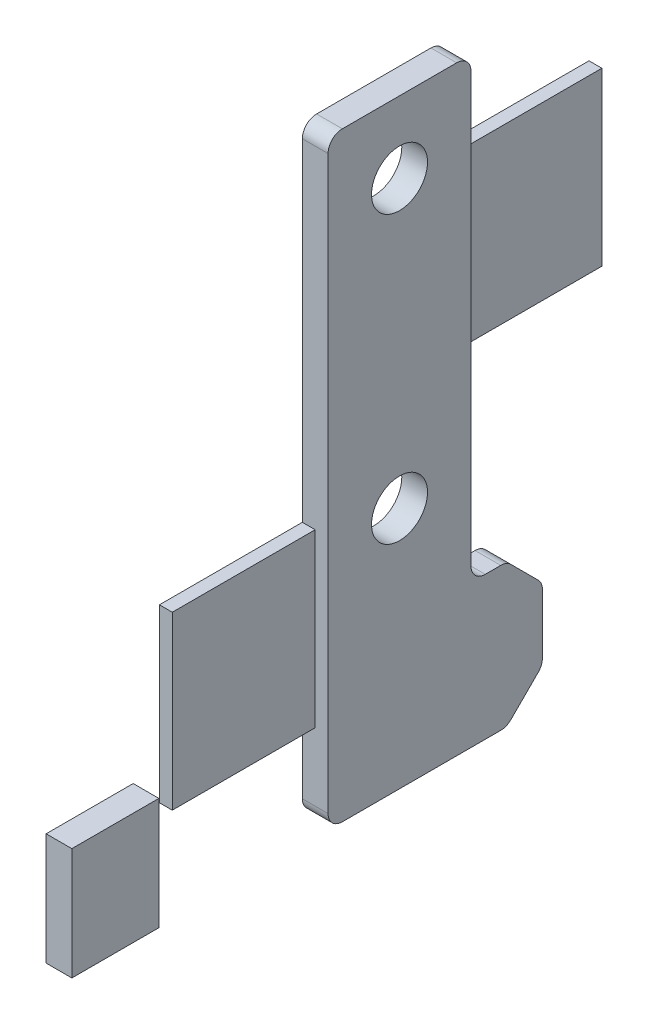
ISO-10303-21;
HEADER;
FILE_DESCRIPTION(('STEP AP214'),'2;1');
FILE_NAME('part.step','',(''),(''),'','','');
FILE_SCHEMA(('AUTOMOTIVE_DESIGN { 1 0 10303 214 1 1 1 1 }'));
ENDSEC;
DATA;
#1=APPLICATION_CONTEXT('core data for automotive mechanical design processes');
#2=APPLICATION_PROTOCOL_DEFINITION('international standard','automotive_design',2000,#1);
#3=PRODUCT_CONTEXT('',#1,'mechanical');
#4=PRODUCT('Part','Part','',(#3));
#5=PRODUCT_RELATED_PRODUCT_CATEGORY('part','',(#4));
#6=PRODUCT_DEFINITION_FORMATION('','',#4);
#7=PRODUCT_DEFINITION_CONTEXT('part definition',#1,'design');
#8=PRODUCT_DEFINITION('design','',#6,#7);
#9=PRODUCT_DEFINITION_SHAPE('','',#8);
#10=(LENGTH_UNIT() NAMED_UNIT(*) SI_UNIT(.MILLI.,.METRE.));
#11=(NAMED_UNIT(*) PLANE_ANGLE_UNIT() SI_UNIT($,.RADIAN.));
#12=(NAMED_UNIT(*) SI_UNIT($,.STERADIAN.) SOLID_ANGLE_UNIT());
#13=UNCERTAINTY_MEASURE_WITH_UNIT(LENGTH_MEASURE(1.E-05),#10,'distance_accuracy_value','');
#14=(GEOMETRIC_REPRESENTATION_CONTEXT(3) GLOBAL_UNCERTAINTY_ASSIGNED_CONTEXT((#13)) GLOBAL_UNIT_ASSIGNED_CONTEXT((#10,
#11,#12)) REPRESENTATION_CONTEXT('',''));
#15=CARTESIAN_POINT('',(0.,0.,0.));
#16=DIRECTION('',(0.,0.,1.));
#17=DIRECTION('',(1.,0.,0.));
#18=AXIS2_PLACEMENT_3D('',#15,#16,#17);
#19=CARTESIAN_POINT('',(14.8946076048408,0.,14.0803932968794));
#20=DIRECTION('',(0.,0.,1.));
#21=DIRECTION('',(1.,0.,0.));
#22=AXIS2_PLACEMENT_3D('',#19,#20,#21);
#23=PLANE('',#22);
#24=DIRECTION('',(0.,-1.,0.));
#25=VECTOR('',#24,1.);
#26=CARTESIAN_POINT('',(2.286,0.,14.0803932968794));
#27=LINE('',#26,#25);
#28=CARTESIAN_POINT('',(2.286,9.95723934664028,14.0803932968794));
#29=VERTEX_POINT('',#28);
#30=CARTESIAN_POINT('',(2.286,0.,14.0803932968794));
#31=VERTEX_POINT('',#30);
#32=EDGE_CURVE('E78',#29,#31,#27,.T.);
#33=ORIENTED_EDGE('',*,*,#32,.F.);
#34=DIRECTION('',(-1.,0.,0.));
#35=VECTOR('',#34,1.);
#36=CARTESIAN_POINT('',(14.8946076048408,9.95723934664028,14.0803932968794));
#37=LINE('',#36,#35);
#38=CARTESIAN_POINT('',(0.,9.95723934664028,14.0803932968794));
#39=VERTEX_POINT('',#38);
#40=EDGE_CURVE('E106',#29,#39,#37,.T.);
#41=ORIENTED_EDGE('',*,*,#40,.T.);
#42=DIRECTION('',(0.,1.,0.));
#43=VECTOR('',#42,1.);
#44=CARTESIAN_POINT('',(0.,0.,14.0803932968794));
#45=LINE('',#44,#43);
#46=CARTESIAN_POINT('',(0.,0.,14.0803932968794));
#47=VERTEX_POINT('',#46);
#48=EDGE_CURVE('E110',#47,#39,#45,.T.);
#49=ORIENTED_EDGE('',*,*,#48,.F.);
#50=DIRECTION('',(-1.,0.,0.));
#51=VECTOR('',#50,1.);
#52=CARTESIAN_POINT('',(14.8946076048408,0.,14.0803932968794));
#53=LINE('',#52,#51);
#54=EDGE_CURVE('E133',#31,#47,#53,.T.);
#55=ORIENTED_EDGE('',*,*,#54,.F.);
#56=EDGE_LOOP('',(#33,#41,#49,#55));
#57=FACE_BOUND('',#56,.T.);
#58=ADVANCED_FACE('F70',(#57),#23,.T.);
#59=CARTESIAN_POINT('',(14.8946076048408,0.,14.0803932968794));
#60=DIRECTION('',(0.,-1.,0.));
#61=DIRECTION('',(0.,0.,-1.));
#62=AXIS2_PLACEMENT_3D('',#59,#60,#61);
#63=PLANE('',#62);
#64=DIRECTION('',(0.,0.,-1.));
#65=VECTOR('',#64,1.);
#66=CARTESIAN_POINT('',(2.286,0.,14.0803932968794));
#67=LINE('',#66,#65);
#68=CARTESIAN_POINT('',(2.286,0.,6.34538390279538));
#69=VERTEX_POINT('',#68);
#70=EDGE_CURVE('E84',#31,#69,#67,.T.);
#71=ORIENTED_EDGE('',*,*,#70,.F.);
#72=ORIENTED_EDGE('',*,*,#54,.T.);
#73=DIRECTION('',(0.,0.,1.));
#74=VECTOR('',#73,1.);
#75=CARTESIAN_POINT('',(0.,0.,14.0803932968794));
#76=LINE('',#75,#74);
#77=CARTESIAN_POINT('',(0.,0.,6.34538390279538));
#78=VERTEX_POINT('',#77);
#79=EDGE_CURVE('E115',#78,#47,#76,.T.);
#80=ORIENTED_EDGE('',*,*,#79,.F.);
#81=DIRECTION('',(-1.,0.,0.));
#82=VECTOR('',#81,1.);
#83=CARTESIAN_POINT('',(14.8946076048408,0.,6.34538390279538));
#84=LINE('',#83,#82);
#85=EDGE_CURVE('E136',#69,#78,#84,.T.);
#86=ORIENTED_EDGE('',*,*,#85,.F.);
#87=EDGE_LOOP('',(#71,#72,#80,#86));
#88=FACE_BOUND('',#87,.T.);
#89=ADVANCED_FACE('F142',(#88),#63,.T.);
#90=CARTESIAN_POINT('',(14.8946076048408,0.,6.34538390279538));
#91=DIRECTION('',(0.,0.,-1.));
#92=DIRECTION('',(-1.,0.,0.));
#93=AXIS2_PLACEMENT_3D('',#90,#91,#92);
#94=PLANE('',#93);
#95=DIRECTION('',(0.,1.,0.));
#96=VECTOR('',#95,1.);
#97=CARTESIAN_POINT('',(2.286,0.,6.34538390279538));
#98=LINE('',#97,#96);
#99=CARTESIAN_POINT('',(2.286,9.95723934664028,6.34538390279538));
#100=VERTEX_POINT('',#99);
#101=EDGE_CURVE('E135',#69,#100,#98,.T.);
#102=ORIENTED_EDGE('',*,*,#101,.F.);
#103=ORIENTED_EDGE('',*,*,#85,.T.);
#104=DIRECTION('',(0.,-1.,0.));
#105=VECTOR('',#104,1.);
#106=CARTESIAN_POINT('',(0.,0.,6.34538390279538));
#107=LINE('',#106,#105);
#108=CARTESIAN_POINT('',(0.,9.95723934664028,6.34538390279538));
#109=VERTEX_POINT('',#108);
#110=EDGE_CURVE('E123',#109,#78,#107,.T.);
#111=ORIENTED_EDGE('',*,*,#110,.F.);
#112=DIRECTION('',(-1.,0.,0.));
#113=VECTOR('',#112,1.);
#114=CARTESIAN_POINT('',(14.8946076048408,9.95723934664028,6.34538390279538));
#115=LINE('',#114,#113);
#116=EDGE_CURVE('E114',#100,#109,#115,.T.);
#117=ORIENTED_EDGE('',*,*,#116,.F.);
#118=EDGE_LOOP('',(#102,#103,#111,#117));
#119=FACE_BOUND('',#118,.T.);
#120=ADVANCED_FACE('F140',(#119),#94,.T.);
#121=CARTESIAN_POINT('',(14.8946076048408,9.95723934664028,14.0803932968794));
#122=DIRECTION('',(0.,1.,0.));
#123=DIRECTION('',(0.,0.,1.));
#124=AXIS2_PLACEMENT_3D('',#121,#122,#123);
#125=PLANE('',#124);
#126=DIRECTION('',(0.,0.,1.));
#127=VECTOR('',#126,1.);
#128=CARTESIAN_POINT('',(2.286,9.95723934664028,14.0803932968794));
#129=LINE('',#128,#127);
#130=EDGE_CURVE('E13',#100,#29,#129,.T.);
#131=ORIENTED_EDGE('',*,*,#130,.F.);
#132=ORIENTED_EDGE('',*,*,#116,.T.);
#133=DIRECTION('',(0.,0.,-1.));
#134=VECTOR('',#133,1.);
#135=CARTESIAN_POINT('',(0.,9.95723934664028,14.0803932968794));
#136=LINE('',#135,#134);
#137=EDGE_CURVE('E117',#39,#109,#136,.T.);
#138=ORIENTED_EDGE('',*,*,#137,.F.);
#139=ORIENTED_EDGE('',*,*,#40,.F.);
#140=EDGE_LOOP('',(#131,#132,#138,#139));
#141=FACE_BOUND('',#140,.T.);
#142=ADVANCED_FACE('F118',(#141),#125,.T.);
#143=CARTESIAN_POINT('',(0.,0.,0.));
#144=DIRECTION('',(-1.,0.,0.));
#145=DIRECTION('',(0.,0.,1.));
#146=AXIS2_PLACEMENT_3D('',#143,#144,#145);
#147=PLANE('',#146);
#148=ORIENTED_EDGE('',*,*,#48,.T.);
#149=ORIENTED_EDGE('',*,*,#137,.T.);
#150=ORIENTED_EDGE('',*,*,#110,.T.);
#151=ORIENTED_EDGE('',*,*,#79,.T.);
#152=EDGE_LOOP('',(#148,#149,#150,#151));
#153=FACE_BOUND('',#152,.T.);
#154=ADVANCED_FACE('F125',(#153),#147,.T.);
#155=CARTESIAN_POINT('',(2.286,0.,0.));
#156=DIRECTION('',(-1.,0.,0.));
#157=DIRECTION('',(0.,0.,1.));
#158=AXIS2_PLACEMENT_3D('',#155,#156,#157);
#159=PLANE('',#158);
#160=ORIENTED_EDGE('',*,*,#32,.T.);
#161=ORIENTED_EDGE('',*,*,#70,.T.);
#162=ORIENTED_EDGE('',*,*,#101,.T.);
#163=ORIENTED_EDGE('',*,*,#130,.T.);
#164=EDGE_LOOP('',(#160,#161,#162,#163));
#165=FACE_BOUND('',#164,.T.);
#166=ADVANCED_FACE('F144',(#165),#159,.F.);
#167=CLOSED_SHELL('',(#58,#89,#120,#142,#154,#166));
#168=MANIFOLD_SOLID_BREP('B2',#167);
#169=CARTESIAN_POINT('',(2.286,0.,0.));
#170=DIRECTION('',(-1.,0.,0.));
#171=DIRECTION('',(0.,0.,1.));
#172=AXIS2_PLACEMENT_3D('',#169,#170,#171);
#173=PLANE('',#172);
#174=DIRECTION('',(0.,-0.707106781186546,0.707106781186549));
#175=VECTOR('',#174,1.);
#176=CARTESIAN_POINT('',(2.286,3.17499999999999,-27.7380499050858));
#177=LINE('',#176,#175);
#178=CARTESIAN_POINT('',(2.286,0.37197438789308,-24.9350242929789));
#179=VERTEX_POINT('',#178);
#180=CARTESIAN_POINT('',(2.286,2.8030256121069,-27.3660755171927));
#181=VERTEX_POINT('',#180);
#182=EDGE_CURVE('E585',#179,#181,#177,.F.);
#183=ORIENTED_EDGE('',*,*,#182,.T.);
#184=CARTESIAN_POINT('',(2.286,3.70105122421382,-26.4680499050858));
#185=DIRECTION('',(-1.,0.,0.));
#186=DIRECTION('',(0.,0.,1.));
#187=AXIS2_PLACEMENT_3D('',#184,#185,#186);
#188=CIRCLE('',#187,1.27);
#189=CARTESIAN_POINT('',(2.286,3.70105122421382,-27.7380499050858));
#190=VERTEX_POINT('',#189);
#191=EDGE_CURVE('E504',#181,#190,#188,.F.);
#192=ORIENTED_EDGE('',*,*,#191,.T.);
#193=DIRECTION('',(0.,1.,0.));
#194=VECTOR('',#193,1.);
#195=CARTESIAN_POINT('',(2.286,12.7,-27.7380499050858));
#196=LINE('',#195,#194);
#197=CARTESIAN_POINT('',(2.286,8.99894877578617,-27.7380499050858));
#198=VERTEX_POINT('',#197);
#199=EDGE_CURVE('E454',#190,#198,#196,.T.);
#200=ORIENTED_EDGE('',*,*,#199,.T.);
#201=CARTESIAN_POINT('',(2.286,8.99894877578617,-26.4680499050858));
#202=DIRECTION('',(-1.,0.,0.));
#203=DIRECTION('',(0.,0.,1.));
#204=AXIS2_PLACEMENT_3D('',#201,#202,#203);
#205=CIRCLE('',#204,1.27);
#206=CARTESIAN_POINT('',(2.286,9.89697438789308,-27.3660755171927));
#207=VERTEX_POINT('',#206);
#208=EDGE_CURVE('E495',#198,#207,#205,.F.);
#209=ORIENTED_EDGE('',*,*,#208,.T.);
#210=DIRECTION('',(0.,-0.707106781186549,-0.707106781186546));
#211=VECTOR('',#210,1.);
#212=CARTESIAN_POINT('',(2.286,12.7,-24.5630499050858));
#213=LINE('',#212,#211);
#214=CARTESIAN_POINT('',(2.286,12.3280256121069,-24.9350242929789));
#215=VERTEX_POINT('',#214);
#216=EDGE_CURVE('E582',#207,#215,#213,.F.);
#217=ORIENTED_EDGE('',*,*,#216,.T.);
#218=CARTESIAN_POINT('',(2.286,11.43,-24.036998680872));
#219=DIRECTION('',(-1.,0.,0.));
#220=DIRECTION('',(0.,0.,1.));
#221=AXIS2_PLACEMENT_3D('',#218,#219,#220);
#222=CIRCLE('',#221,1.27);
#223=CARTESIAN_POINT('',(2.286,12.7,-24.036998680872));
#224=VERTEX_POINT('',#223);
#225=EDGE_CURVE('E493',#215,#224,#222,.F.);
#226=ORIENTED_EDGE('',*,*,#225,.T.);
#227=DIRECTION('',(0.,0.,1.));
#228=VECTOR('',#227,1.);
#229=CARTESIAN_POINT('',(2.286,12.7,-21.3880499050858));
#230=LINE('',#229,#228);
#231=CARTESIAN_POINT('',(2.286,12.7,-22.6580499050858));
#232=VERTEX_POINT('',#231);
#233=EDGE_CURVE('E458',#224,#232,#230,.T.);
#234=ORIENTED_EDGE('',*,*,#233,.T.);
#235=CARTESIAN_POINT('',(2.286,13.97,-22.6580499050858));
#236=DIRECTION('',(-1.,0.,0.));
#237=DIRECTION('',(0.,0.,1.));
#238=AXIS2_PLACEMENT_3D('',#235,#236,#237);
#239=CIRCLE('',#238,1.27);
#240=CARTESIAN_POINT('',(2.286,13.97,-21.3880499050858));
#241=VERTEX_POINT('',#240);
#242=EDGE_CURVE('E68',#232,#241,#239,.T.);
#243=ORIENTED_EDGE('',*,*,#242,.T.);
#244=DIRECTION('',(0.,1.,0.));
#245=VECTOR('',#244,1.);
#246=CARTESIAN_POINT('',(2.286,53.34,-21.3880499050858));
#247=LINE('',#246,#245);
#248=CARTESIAN_POINT('',(2.286,52.07,-21.3880499050858));
#249=VERTEX_POINT('',#248);
#250=EDGE_CURVE('E464',#241,#249,#247,.T.);
#251=ORIENTED_EDGE('',*,*,#250,.T.);
#252=CARTESIAN_POINT('',(2.286,52.07,-20.1180499050858));
#253=DIRECTION('',(-1.,0.,0.));
#254=DIRECTION('',(0.,0.,1.));
#255=AXIS2_PLACEMENT_3D('',#252,#253,#254);
#256=CIRCLE('',#255,1.27);
#257=CARTESIAN_POINT('',(2.286,53.34,-20.1180499050858));
#258=VERTEX_POINT('',#257);
#259=EDGE_CURVE('E482',#249,#258,#256,.F.);
#260=ORIENTED_EDGE('',*,*,#259,.T.);
#261=DIRECTION('',(0.,0.,1.));
#262=VECTOR('',#261,1.);
#263=CARTESIAN_POINT('',(2.286,53.34,-8.68804990508582));
#264=LINE('',#263,#262);
#265=CARTESIAN_POINT('',(2.286,53.34,-9.95804990508582));
#266=VERTEX_POINT('',#265);
#267=EDGE_CURVE('E442',#258,#266,#264,.T.);
#268=ORIENTED_EDGE('',*,*,#267,.T.);
#269=CARTESIAN_POINT('',(2.286,52.07,-9.95804990508582));
#270=DIRECTION('',(-1.,0.,0.));
#271=DIRECTION('',(0.,0.,1.));
#272=AXIS2_PLACEMENT_3D('',#269,#270,#271);
#273=CIRCLE('',#272,1.27);
#274=CARTESIAN_POINT('',(2.286,52.07,-8.68804990508582));
#275=VERTEX_POINT('',#274);
#276=EDGE_CURVE('E480',#266,#275,#273,.F.);
#277=ORIENTED_EDGE('',*,*,#276,.T.);
#278=DIRECTION('',(0.,-1.,0.));
#279=VECTOR('',#278,1.);
#280=CARTESIAN_POINT('',(2.286,0.,-8.68804990508582));
#281=LINE('',#280,#279);
#282=CARTESIAN_POINT('',(2.286,1.27,-8.68804990508582));
#283=VERTEX_POINT('',#282);
#284=EDGE_CURVE('E435',#275,#283,#281,.T.);
#285=ORIENTED_EDGE('',*,*,#284,.T.);
#286=CARTESIAN_POINT('',(2.286,1.27,-9.95804990508582));
#287=DIRECTION('',(-1.,0.,0.));
#288=DIRECTION('',(0.,0.,1.));
#289=AXIS2_PLACEMENT_3D('',#286,#287,#288);
#290=CIRCLE('',#289,1.27);
#291=CARTESIAN_POINT('',(2.286,0.,-9.95804990508582));
#292=VERTEX_POINT('',#291);
#293=EDGE_CURVE('E497',#283,#292,#290,.F.);
#294=ORIENTED_EDGE('',*,*,#293,.T.);
#295=DIRECTION('',(0.,0.,-1.));
#296=VECTOR('',#295,1.);
#297=CARTESIAN_POINT('',(2.286,0.,-27.7380499050858));
#298=LINE('',#297,#296);
#299=CARTESIAN_POINT('',(2.286,0.,-24.036998680872));
#300=VERTEX_POINT('',#299);
#301=EDGE_CURVE('E459',#292,#300,#298,.T.);
#302=ORIENTED_EDGE('',*,*,#301,.T.);
#303=CARTESIAN_POINT('',(2.286,1.27,-24.036998680872));
#304=DIRECTION('',(-1.,0.,0.));
#305=DIRECTION('',(0.,0.,1.));
#306=AXIS2_PLACEMENT_3D('',#303,#304,#305);
#307=CIRCLE('',#306,1.27);
#308=EDGE_CURVE('E502',#300,#179,#307,.F.);
#309=ORIENTED_EDGE('',*,*,#308,.T.);
#310=EDGE_LOOP('',(#183,#192,#200,#209,#217,#226,#234,#243,#251,#260,#268,#277,#285,#294,#302,#309));
#311=FACE_BOUND('',#310,.T.);
#312=CARTESIAN_POINT('',(2.286,46.99,-15.0380499050858));
#313=DIRECTION('',(1.,0.,0.));
#314=DIRECTION('',(0.,0.,-1.));
#315=AXIS2_PLACEMENT_3D('',#312,#313,#314);
#316=CIRCLE('',#315,2.4892);
#317=CARTESIAN_POINT('',(2.286,46.99,-17.5272499050858));
#318=VERTEX_POINT('',#317);
#319=EDGE_CURVE('E623',#318,#318,#316,.T.);
#320=ORIENTED_EDGE('',*,*,#319,.F.);
#321=EDGE_LOOP('',(#320));
#322=FACE_BOUND('',#321,.T.);
#323=CARTESIAN_POINT('',(2.286,21.59,-15.0380499050858));
#324=DIRECTION('',(1.,0.,0.));
#325=DIRECTION('',(0.,0.,-1.));
#326=AXIS2_PLACEMENT_3D('',#323,#324,#325);
#327=CIRCLE('',#326,2.4892);
#328=CARTESIAN_POINT('',(2.286,21.59,-17.5272499050858));
#329=VERTEX_POINT('',#328);
#330=EDGE_CURVE('E421',#329,#329,#327,.T.);
#331=ORIENTED_EDGE('',*,*,#330,.F.);
#332=EDGE_LOOP('',(#331));
#333=FACE_BOUND('',#332,.T.);
#334=ADVANCED_FACE('F195',(#311,#322,#333),#173,.F.);
#335=CARTESIAN_POINT('',(0.,0.,0.));
#336=DIRECTION('',(-1.,0.,0.));
#337=DIRECTION('',(0.,0.,1.));
#338=AXIS2_PLACEMENT_3D('',#335,#336,#337);
#339=PLANE('',#338);
#340=CARTESIAN_POINT('',(0.,46.99,-15.0380499050858));
#341=DIRECTION('',(1.,0.,0.));
#342=DIRECTION('',(0.,0.,-1.));
#343=AXIS2_PLACEMENT_3D('',#340,#341,#342);
#344=CIRCLE('',#343,2.4892);
#345=CARTESIAN_POINT('',(0.,46.99,-17.5272499050858));
#346=VERTEX_POINT('',#345);
#347=EDGE_CURVE('E425',#346,#346,#344,.T.);
#348=ORIENTED_EDGE('',*,*,#347,.T.);
#349=EDGE_LOOP('',(#348));
#350=FACE_BOUND('',#349,.T.);
#351=DIRECTION('',(0.,1.,0.));
#352=VECTOR('',#351,1.);
#353=CARTESIAN_POINT('',(0.,12.7,-27.7380499050858));
#354=LINE('',#353,#352);
#355=CARTESIAN_POINT('',(0.,3.70105122421382,-27.7380499050858));
#356=VERTEX_POINT('',#355);
#357=CARTESIAN_POINT('',(0.,8.99894877578617,-27.7380499050858));
#358=VERTEX_POINT('',#357);
#359=EDGE_CURVE('E548',#356,#358,#354,.T.);
#360=ORIENTED_EDGE('',*,*,#359,.F.);
#361=CARTESIAN_POINT('',(0.,3.70105122421382,-26.4680499050858));
#362=DIRECTION('',(-1.,0.,0.));
#363=DIRECTION('',(0.,0.,1.));
#364=AXIS2_PLACEMENT_3D('',#361,#362,#363);
#365=CIRCLE('',#364,1.27);
#366=CARTESIAN_POINT('',(0.,2.8030256121069,-27.3660755171927));
#367=VERTEX_POINT('',#366);
#368=EDGE_CURVE('E605',#356,#367,#365,.T.);
#369=ORIENTED_EDGE('',*,*,#368,.T.);
#370=DIRECTION('',(0.,0.707106781186546,-0.707106781186549));
#371=VECTOR('',#370,1.);
#372=CARTESIAN_POINT('',(0.,-12.2815249525429,-12.2815249525429));
#373=LINE('',#372,#371);
#374=CARTESIAN_POINT('',(0.,0.371974387893079,-24.9350242929789));
#375=VERTEX_POINT('',#374);
#376=EDGE_CURVE('E579',#367,#375,#373,.F.);
#377=ORIENTED_EDGE('',*,*,#376,.T.);
#378=CARTESIAN_POINT('',(0.,1.27,-24.036998680872));
#379=DIRECTION('',(-1.,0.,0.));
#380=DIRECTION('',(0.,0.,1.));
#381=AXIS2_PLACEMENT_3D('',#378,#379,#380);
#382=CIRCLE('',#381,1.27);
#383=CARTESIAN_POINT('',(0.,0.,-24.036998680872));
#384=VERTEX_POINT('',#383);
#385=EDGE_CURVE('E603',#375,#384,#382,.T.);
#386=ORIENTED_EDGE('',*,*,#385,.T.);
#387=DIRECTION('',(0.,0.,-1.));
#388=VECTOR('',#387,1.);
#389=CARTESIAN_POINT('',(0.,0.,-27.7380499050858));
#390=LINE('',#389,#388);
#391=CARTESIAN_POINT('',(0.,0.,-9.95804990508582));
#392=VERTEX_POINT('',#391);
#393=EDGE_CURVE('E444',#392,#384,#390,.T.);
#394=ORIENTED_EDGE('',*,*,#393,.F.);
#395=CARTESIAN_POINT('',(0.,1.27,-9.95804990508582));
#396=DIRECTION('',(-1.,0.,0.));
#397=DIRECTION('',(0.,0.,1.));
#398=AXIS2_PLACEMENT_3D('',#395,#396,#397);
#399=CIRCLE('',#398,1.27);
#400=CARTESIAN_POINT('',(0.,1.27,-8.68804990508582));
#401=VERTEX_POINT('',#400);
#402=EDGE_CURVE('E592',#392,#401,#399,.T.);
#403=ORIENTED_EDGE('',*,*,#402,.T.);
#404=DIRECTION('',(0.,-1.,0.));
#405=VECTOR('',#404,1.);
#406=CARTESIAN_POINT('',(0.,0.,-8.68804990508582));
#407=LINE('',#406,#405);
#408=CARTESIAN_POINT('',(0.,7.3064323063278,-8.68804990508582));
#409=VERTEX_POINT('',#408);
#410=EDGE_CURVE('E564',#409,#401,#407,.T.);
#411=ORIENTED_EDGE('',*,*,#410,.F.);
#412=DIRECTION('',(0.,0.,1.));
#413=VECTOR('',#412,1.);
#414=CARTESIAN_POINT('',(0.,7.3064323063278,-8.68804990508582));
#415=LINE('',#414,#413);
#416=CARTESIAN_POINT('',(0.,7.30643230632781,4.01195009491418));
#417=VERTEX_POINT('',#416);
#418=EDGE_CURVE('E406',#409,#417,#415,.T.);
#419=ORIENTED_EDGE('',*,*,#418,.T.);
#420=DIRECTION('',(0.,1.,0.));
#421=VECTOR('',#420,1.);
#422=CARTESIAN_POINT('',(0.,22.5464323063278,4.01195009491418));
#423=LINE('',#422,#421);
#424=CARTESIAN_POINT('',(0.,22.5464323063278,4.01195009491418));
#425=VERTEX_POINT('',#424);
#426=EDGE_CURVE('E395',#417,#425,#423,.T.);
#427=ORIENTED_EDGE('',*,*,#426,.T.);
#428=DIRECTION('',(0.,0.,-1.));
#429=VECTOR('',#428,1.);
#430=CARTESIAN_POINT('',(0.,22.5464323063278,-8.68804990508582));
#431=LINE('',#430,#429);
#432=CARTESIAN_POINT('',(0.,22.5464323063278,-8.68804990508582));
#433=VERTEX_POINT('',#432);
#434=EDGE_CURVE('E388',#425,#433,#431,.T.);
#435=ORIENTED_EDGE('',*,*,#434,.T.);
#436=CARTESIAN_POINT('',(0.,52.07,-8.68804990508582));
#437=VERTEX_POINT('',#436);
#438=EDGE_CURVE('E567',#437,#433,#407,.T.);
#439=ORIENTED_EDGE('',*,*,#438,.F.);
#440=CARTESIAN_POINT('',(0.,52.07,-9.95804990508582));
#441=DIRECTION('',(-1.,0.,0.));
#442=DIRECTION('',(0.,0.,1.));
#443=AXIS2_PLACEMENT_3D('',#440,#441,#442);
#444=CIRCLE('',#443,1.27);
#445=CARTESIAN_POINT('',(0.,53.34,-9.95804990508582));
#446=VERTEX_POINT('',#445);
#447=EDGE_CURVE('E563',#437,#446,#444,.T.);
#448=ORIENTED_EDGE('',*,*,#447,.T.);
#449=DIRECTION('',(0.,0.,1.));
#450=VECTOR('',#449,1.);
#451=CARTESIAN_POINT('',(0.,53.34,-8.68804990508582));
#452=LINE('',#451,#450);
#453=CARTESIAN_POINT('',(0.,53.34,-20.1180499050858));
#454=VERTEX_POINT('',#453);
#455=EDGE_CURVE('E561',#454,#446,#452,.T.);
#456=ORIENTED_EDGE('',*,*,#455,.F.);
#457=CARTESIAN_POINT('',(0.,52.07,-20.1180499050858));
#458=DIRECTION('',(-1.,0.,0.));
#459=DIRECTION('',(0.,0.,1.));
#460=AXIS2_PLACEMENT_3D('',#457,#458,#459);
#461=CIRCLE('',#460,1.27);
#462=CARTESIAN_POINT('',(0.,52.07,-21.3880499050858));
#463=VERTEX_POINT('',#462);
#464=EDGE_CURVE('E557',#454,#463,#461,.T.);
#465=ORIENTED_EDGE('',*,*,#464,.T.);
#466=DIRECTION('',(0.,1.,0.));
#467=VECTOR('',#466,1.);
#468=CARTESIAN_POINT('',(0.,53.34,-21.3880499050858));
#469=LINE('',#468,#467);
#470=CARTESIAN_POINT('',(0.,45.3271489488394,-21.3880499050858));
#471=VERTEX_POINT('',#470);
#472=EDGE_CURVE('E547',#471,#463,#469,.T.);
#473=ORIENTED_EDGE('',*,*,#472,.F.);
#474=DIRECTION('',(0.,0.,-1.));
#475=VECTOR('',#474,1.);
#476=CARTESIAN_POINT('',(0.,45.3271489488394,-21.3880499050858));
#477=LINE('',#476,#475);
#478=CARTESIAN_POINT('',(0.,45.3271489488394,-34.1657046581716));
#479=VERTEX_POINT('',#478);
#480=EDGE_CURVE('E384',#471,#479,#477,.T.);
#481=ORIENTED_EDGE('',*,*,#480,.T.);
#482=DIRECTION('',(0.,-1.,0.));
#483=VECTOR('',#482,1.);
#484=CARTESIAN_POINT('',(0.,45.3271489488394,-34.1657046581716));
#485=LINE('',#484,#483);
#486=CARTESIAN_POINT('',(0.,30.0871489488394,-34.1657046581716));
#487=VERTEX_POINT('',#486);
#488=EDGE_CURVE('E361',#479,#487,#485,.T.);
#489=ORIENTED_EDGE('',*,*,#488,.T.);
#490=DIRECTION('',(0.,0.,1.));
#491=VECTOR('',#490,1.);
#492=CARTESIAN_POINT('',(0.,30.0871489488394,-21.3880499050858));
#493=LINE('',#492,#491);
#494=CARTESIAN_POINT('',(0.,30.0871489488394,-21.3880499050858));
#495=VERTEX_POINT('',#494);
#496=EDGE_CURVE('E377',#487,#495,#493,.T.);
#497=ORIENTED_EDGE('',*,*,#496,.T.);
#498=CARTESIAN_POINT('',(0.,13.97,-21.3880499050858));
#499=VERTEX_POINT('',#498);
#500=EDGE_CURVE('E539',#499,#495,#469,.T.);
#501=ORIENTED_EDGE('',*,*,#500,.F.);
#502=CARTESIAN_POINT('',(0.,13.97,-22.6580499050858));
#503=DIRECTION('',(-1.,0.,0.));
#504=DIRECTION('',(0.,0.,1.));
#505=AXIS2_PLACEMENT_3D('',#502,#503,#504);
#506=CIRCLE('',#505,1.27);
#507=CARTESIAN_POINT('',(0.,12.7,-22.6580499050858));
#508=VERTEX_POINT('',#507);
#509=EDGE_CURVE('E204',#499,#508,#506,.F.);
#510=ORIENTED_EDGE('',*,*,#509,.T.);
#511=DIRECTION('',(0.,0.,1.));
#512=VECTOR('',#511,1.);
#513=CARTESIAN_POINT('',(0.,12.7,-21.3880499050858));
#514=LINE('',#513,#512);
#515=CARTESIAN_POINT('',(0.,12.7,-24.036998680872));
#516=VERTEX_POINT('',#515);
#517=EDGE_CURVE('E538',#516,#508,#514,.T.);
#518=ORIENTED_EDGE('',*,*,#517,.F.);
#519=CARTESIAN_POINT('',(0.,11.43,-24.036998680872));
#520=DIRECTION('',(-1.,0.,0.));
#521=DIRECTION('',(0.,0.,1.));
#522=AXIS2_PLACEMENT_3D('',#519,#520,#521);
#523=CIRCLE('',#522,1.27);
#524=CARTESIAN_POINT('',(0.,12.3280256121069,-24.9350242929789));
#525=VERTEX_POINT('',#524);
#526=EDGE_CURVE('E599',#516,#525,#523,.T.);
#527=ORIENTED_EDGE('',*,*,#526,.T.);
#528=DIRECTION('',(0.,0.707106781186549,0.707106781186546));
#529=VECTOR('',#528,1.);
#530=CARTESIAN_POINT('',(0.,18.6315249525429,-18.631524952543));
#531=LINE('',#530,#529);
#532=CARTESIAN_POINT('',(0.,9.89697438789308,-27.3660755171927));
#533=VERTEX_POINT('',#532);
#534=EDGE_CURVE('E441',#525,#533,#531,.F.);
#535=ORIENTED_EDGE('',*,*,#534,.T.);
#536=CARTESIAN_POINT('',(0.,8.99894877578617,-26.4680499050858));
#537=DIRECTION('',(-1.,0.,0.));
#538=DIRECTION('',(0.,0.,1.));
#539=AXIS2_PLACEMENT_3D('',#536,#537,#538);
#540=CIRCLE('',#539,1.27);
#541=EDGE_CURVE('E601',#533,#358,#540,.T.);
#542=ORIENTED_EDGE('',*,*,#541,.T.);
#543=EDGE_LOOP('',(#360,#369,#377,#386,#394,#403,#411,#419,#427,#435,#439,#448,#456,#465,#473,
#481,#489,#497,#501,#510,#518,#527,#535,#542));
#544=FACE_BOUND('',#543,.T.);
#545=CARTESIAN_POINT('',(0.,21.59,-15.0380499050858));
#546=DIRECTION('',(1.,0.,0.));
#547=DIRECTION('',(0.,0.,-1.));
#548=AXIS2_PLACEMENT_3D('',#545,#546,#547);
#549=CIRCLE('',#548,2.4892);
#550=CARTESIAN_POINT('',(0.,21.59,-17.5272499050858));
#551=VERTEX_POINT('',#550);
#552=EDGE_CURVE('E413',#551,#551,#549,.T.);
#553=ORIENTED_EDGE('',*,*,#552,.T.);
#554=EDGE_LOOP('',(#553));
#555=FACE_BOUND('',#554,.T.);
#556=ADVANCED_FACE('F536',(#350,#544,#555),#339,.T.);
#557=CARTESIAN_POINT('',(2.286,0.,-27.7380499050858));
#558=DIRECTION('',(0.,1.,0.));
#559=DIRECTION('',(0.,0.,1.));
#560=AXIS2_PLACEMENT_3D('',#557,#558,#559);
#561=PLANE('',#560);
#562=ORIENTED_EDGE('',*,*,#393,.T.);
#563=DIRECTION('',(-1.,0.,0.));
#564=VECTOR('',#563,1.);
#565=CARTESIAN_POINT('',(2.286,0.,-24.036998680872));
#566=LINE('',#565,#564);
#567=EDGE_CURVE('E509',#384,#300,#566,.F.);
#568=ORIENTED_EDGE('',*,*,#567,.T.);
#569=ORIENTED_EDGE('',*,*,#301,.F.);
#570=DIRECTION('',(-1.,0.,0.));
#571=VECTOR('',#570,1.);
#572=CARTESIAN_POINT('',(2.286,0.,-9.95804990508582));
#573=LINE('',#572,#571);
#574=EDGE_CURVE('E506',#292,#392,#573,.T.);
#575=ORIENTED_EDGE('',*,*,#574,.T.);
#576=EDGE_LOOP('',(#562,#568,#569,#575));
#577=FACE_BOUND('',#576,.T.);
#578=ADVANCED_FACE('F618',(#577),#561,.F.);
#579=CARTESIAN_POINT('',(2.286,12.7,-27.7380499050858));
#580=DIRECTION('',(0.,0.,1.));
#581=DIRECTION('',(1.,0.,0.));
#582=AXIS2_PLACEMENT_3D('',#579,#580,#581);
#583=PLANE('',#582);
#584=ORIENTED_EDGE('',*,*,#199,.F.);
#585=DIRECTION('',(1.,0.,0.));
#586=VECTOR('',#585,1.);
#587=CARTESIAN_POINT('',(0.,3.70105122421382,-27.7380499050858));
#588=LINE('',#587,#586);
#589=EDGE_CURVE('E590',#190,#356,#588,.F.);
#590=ORIENTED_EDGE('',*,*,#589,.T.);
#591=ORIENTED_EDGE('',*,*,#359,.T.);
#592=DIRECTION('',(-1.,0.,0.));
#593=VECTOR('',#592,1.);
#594=CARTESIAN_POINT('',(2.286,8.99894877578617,-27.7380499050858));
#595=LINE('',#594,#593);
#596=EDGE_CURVE('E587',#358,#198,#595,.F.);
#597=ORIENTED_EDGE('',*,*,#596,.T.);
#598=EDGE_LOOP('',(#584,#590,#591,#597));
#599=FACE_BOUND('',#598,.T.);
#600=ADVANCED_FACE('F660',(#599),#583,.F.);
#601=CARTESIAN_POINT('',(2.286,12.7,-21.3880499050858));
#602=DIRECTION('',(0.,-1.,0.));
#603=DIRECTION('',(0.,0.,-1.));
#604=AXIS2_PLACEMENT_3D('',#601,#602,#603);
#605=PLANE('',#604);
#606=ORIENTED_EDGE('',*,*,#233,.F.);
#607=DIRECTION('',(1.,0.,0.));
#608=VECTOR('',#607,1.);
#609=CARTESIAN_POINT('',(0.,12.7,-24.036998680872));
#610=LINE('',#609,#608);
#611=EDGE_CURVE('E518',#224,#516,#610,.F.);
#612=ORIENTED_EDGE('',*,*,#611,.T.);
#613=ORIENTED_EDGE('',*,*,#517,.T.);
#614=DIRECTION('',(-1.,0.,0.));
#615=VECTOR('',#614,1.);
#616=CARTESIAN_POINT('',(2.286,12.7,-22.6580499050858));
#617=LINE('',#616,#615);
#618=EDGE_CURVE('E516',#508,#232,#617,.F.);
#619=ORIENTED_EDGE('',*,*,#618,.T.);
#620=EDGE_LOOP('',(#606,#612,#613,#619));
#621=FACE_BOUND('',#620,.T.);
#622=ADVANCED_FACE('F545',(#621),#605,.F.);
#623=CARTESIAN_POINT('',(2.286,53.34,-21.3880499050858));
#624=DIRECTION('',(0.,0.,1.));
#625=DIRECTION('',(1.,0.,0.));
#626=AXIS2_PLACEMENT_3D('',#623,#624,#625);
#627=PLANE('',#626);
#628=DIRECTION('',(0.,1.,0.));
#629=VECTOR('',#628,1.);
#630=CARTESIAN_POINT('',(1.143,45.3271489488394,-21.3880499050858));
#631=LINE('',#630,#629);
#632=CARTESIAN_POINT('',(1.143,30.0871489488394,-21.3880499050858));
#633=VERTEX_POINT('',#632);
#634=CARTESIAN_POINT('',(1.143,45.3271489488394,-21.3880499050858));
#635=VERTEX_POINT('',#634);
#636=EDGE_CURVE('E216',#633,#635,#631,.T.);
#637=ORIENTED_EDGE('',*,*,#636,.T.);
#638=DIRECTION('',(-1.,0.,0.));
#639=VECTOR('',#638,1.);
#640=CARTESIAN_POINT('',(1.143,45.3271489488394,-21.3880499050858));
#641=LINE('',#640,#639);
#642=EDGE_CURVE('E376',#635,#471,#641,.T.);
#643=ORIENTED_EDGE('',*,*,#642,.T.);
#644=ORIENTED_EDGE('',*,*,#472,.T.);
#645=DIRECTION('',(-1.,0.,0.));
#646=VECTOR('',#645,1.);
#647=CARTESIAN_POINT('',(2.286,52.07,-21.3880499050858));
#648=LINE('',#647,#646);
#649=EDGE_CURVE('E530',#463,#249,#648,.F.);
#650=ORIENTED_EDGE('',*,*,#649,.T.);
#651=ORIENTED_EDGE('',*,*,#250,.F.);
#652=DIRECTION('',(-1.,0.,0.));
#653=VECTOR('',#652,1.);
#654=CARTESIAN_POINT('',(0.,13.97,-21.3880499050858));
#655=LINE('',#654,#653);
#656=EDGE_CURVE('E527',#241,#499,#655,.T.);
#657=ORIENTED_EDGE('',*,*,#656,.T.);
#658=ORIENTED_EDGE('',*,*,#500,.T.);
#659=DIRECTION('',(-1.,0.,0.));
#660=VECTOR('',#659,1.);
#661=CARTESIAN_POINT('',(1.143,30.0871489488394,-21.3880499050858));
#662=LINE('',#661,#660);
#663=EDGE_CURVE('E211',#633,#495,#662,.T.);
#664=ORIENTED_EDGE('',*,*,#663,.F.);
#665=EDGE_LOOP('',(#637,#643,#644,#650,#651,#657,#658,#664));
#666=FACE_BOUND('',#665,.T.);
#667=ADVANCED_FACE('F552',(#666),#627,.F.);
#668=CARTESIAN_POINT('',(2.286,53.34,-8.68804990508582));
#669=DIRECTION('',(0.,-1.,0.));
#670=DIRECTION('',(0.,0.,-1.));
#671=AXIS2_PLACEMENT_3D('',#668,#669,#670);
#672=PLANE('',#671);
#673=ORIENTED_EDGE('',*,*,#455,.T.);
#674=DIRECTION('',(-1.,0.,0.));
#675=VECTOR('',#674,1.);
#676=CARTESIAN_POINT('',(2.286,53.34,-9.95804990508582));
#677=LINE('',#676,#675);
#678=EDGE_CURVE('E490',#446,#266,#677,.F.);
#679=ORIENTED_EDGE('',*,*,#678,.T.);
#680=ORIENTED_EDGE('',*,*,#267,.F.);
#681=DIRECTION('',(-1.,0.,0.));
#682=VECTOR('',#681,1.);
#683=CARTESIAN_POINT('',(2.286,53.34,-20.1180499050858));
#684=LINE('',#683,#682);
#685=EDGE_CURVE('E524',#258,#454,#684,.T.);
#686=ORIENTED_EDGE('',*,*,#685,.T.);
#687=EDGE_LOOP('',(#673,#679,#680,#686));
#688=FACE_BOUND('',#687,.T.);
#689=ADVANCED_FACE('F560',(#688),#672,.F.);
#690=CARTESIAN_POINT('',(2.286,0.,-8.68804990508582));
#691=DIRECTION('',(0.,0.,-1.));
#692=DIRECTION('',(-1.,0.,0.));
#693=AXIS2_PLACEMENT_3D('',#690,#691,#692);
#694=PLANE('',#693);
#695=ORIENTED_EDGE('',*,*,#438,.T.);
#696=DIRECTION('',(-1.,0.,0.));
#697=VECTOR('',#696,1.);
#698=CARTESIAN_POINT('',(1.143,22.5464323063278,-8.68804990508582));
#699=LINE('',#698,#697);
#700=CARTESIAN_POINT('',(1.143,22.5464323063278,-8.68804990508582));
#701=VERTEX_POINT('',#700);
#702=EDGE_CURVE('E403',#701,#433,#699,.T.);
#703=ORIENTED_EDGE('',*,*,#702,.F.);
#704=DIRECTION('',(0.,-1.,0.));
#705=VECTOR('',#704,1.);
#706=CARTESIAN_POINT('',(1.143,22.5464323063278,-8.68804990508582));
#707=LINE('',#706,#705);
#708=CARTESIAN_POINT('',(1.143,7.3064323063278,-8.68804990508582));
#709=VERTEX_POINT('',#708);
#710=EDGE_CURVE('E394',#701,#709,#707,.T.);
#711=ORIENTED_EDGE('',*,*,#710,.T.);
#712=DIRECTION('',(-1.,0.,0.));
#713=VECTOR('',#712,1.);
#714=CARTESIAN_POINT('',(1.143,7.3064323063278,-8.68804990508582));
#715=LINE('',#714,#713);
#716=EDGE_CURVE('E416',#709,#409,#715,.T.);
#717=ORIENTED_EDGE('',*,*,#716,.T.);
#718=ORIENTED_EDGE('',*,*,#410,.T.);
#719=DIRECTION('',(-1.,0.,0.));
#720=VECTOR('',#719,1.);
#721=CARTESIAN_POINT('',(2.286,1.27,-8.68804990508582));
#722=LINE('',#721,#720);
#723=EDGE_CURVE('E521',#401,#283,#722,.F.);
#724=ORIENTED_EDGE('',*,*,#723,.T.);
#725=ORIENTED_EDGE('',*,*,#284,.F.);
#726=DIRECTION('',(-1.,0.,0.));
#727=VECTOR('',#726,1.);
#728=CARTESIAN_POINT('',(2.286,52.07,-8.68804990508582));
#729=LINE('',#728,#727);
#730=EDGE_CURVE('E492',#275,#437,#729,.T.);
#731=ORIENTED_EDGE('',*,*,#730,.T.);
#732=EDGE_LOOP('',(#695,#703,#711,#717,#718,#724,#725,#731));
#733=FACE_BOUND('',#732,.T.);
#734=ADVANCED_FACE('F636',(#733),#694,.F.);
#735=CARTESIAN_POINT('',(2.286,46.99,-15.0380499050858));
#736=DIRECTION('',(-1.,0.,0.));
#737=DIRECTION('',(0.,0.,1.));
#738=AXIS2_PLACEMENT_3D('',#735,#736,#737);
#739=CYLINDRICAL_SURFACE('',#738,2.4892);
#740=ORIENTED_EDGE('',*,*,#319,.T.);
#741=EDGE_LOOP('',(#740));
#742=FACE_BOUND('',#741,.T.);
#743=ORIENTED_EDGE('',*,*,#347,.F.);
#744=EDGE_LOOP('',(#743));
#745=FACE_BOUND('',#744,.T.);
#746=ADVANCED_FACE('F633',(#742,#745),#739,.F.);
#747=CARTESIAN_POINT('',(2.286,21.59,-15.0380499050858));
#748=DIRECTION('',(-1.,0.,0.));
#749=DIRECTION('',(0.,0.,1.));
#750=AXIS2_PLACEMENT_3D('',#747,#748,#749);
#751=CYLINDRICAL_SURFACE('',#750,2.4892);
#752=ORIENTED_EDGE('',*,*,#330,.T.);
#753=EDGE_LOOP('',(#752));
#754=FACE_BOUND('',#753,.T.);
#755=ORIENTED_EDGE('',*,*,#552,.F.);
#756=EDGE_LOOP('',(#755));
#757=FACE_BOUND('',#756,.T.);
#758=ADVANCED_FACE('F635',(#754,#757),#751,.F.);
#759=CARTESIAN_POINT('',(2.286,3.17499999999999,-27.7380499050858));
#760=DIRECTION('',(0.,0.707106781186549,0.707106781186546));
#761=DIRECTION('',(-1.,0.,0.));
#762=AXIS2_PLACEMENT_3D('',#759,#760,#761);
#763=PLANE('',#762);
#764=ORIENTED_EDGE('',*,*,#376,.F.);
#765=DIRECTION('',(-1.,0.,0.));
#766=VECTOR('',#765,1.);
#767=CARTESIAN_POINT('',(2.286,2.8030256121069,-27.3660755171927));
#768=LINE('',#767,#766);
#769=EDGE_CURVE('E609',#367,#181,#768,.F.);
#770=ORIENTED_EDGE('',*,*,#769,.T.);
#771=ORIENTED_EDGE('',*,*,#182,.F.);
#772=DIRECTION('',(1.,0.,0.));
#773=VECTOR('',#772,1.);
#774=CARTESIAN_POINT('',(0.,0.371974387893081,-24.9350242929789));
#775=LINE('',#774,#773);
#776=EDGE_CURVE('E607',#179,#375,#775,.F.);
#777=ORIENTED_EDGE('',*,*,#776,.T.);
#778=EDGE_LOOP('',(#764,#770,#771,#777));
#779=FACE_BOUND('',#778,.T.);
#780=ADVANCED_FACE('F642',(#779),#763,.F.);
#781=CARTESIAN_POINT('',(2.286,12.7,-24.5630499050858));
#782=DIRECTION('',(0.,-0.707106781186546,0.707106781186549));
#783=DIRECTION('',(-1.,0.,0.));
#784=AXIS2_PLACEMENT_3D('',#781,#782,#783);
#785=PLANE('',#784);
#786=ORIENTED_EDGE('',*,*,#216,.F.);
#787=DIRECTION('',(1.,0.,0.));
#788=VECTOR('',#787,1.);
#789=CARTESIAN_POINT('',(0.,9.89697438789308,-27.3660755171927));
#790=LINE('',#789,#788);
#791=EDGE_CURVE('E514',#207,#533,#790,.F.);
#792=ORIENTED_EDGE('',*,*,#791,.T.);
#793=ORIENTED_EDGE('',*,*,#534,.F.);
#794=DIRECTION('',(-1.,0.,0.));
#795=VECTOR('',#794,1.);
#796=CARTESIAN_POINT('',(2.286,12.3280256121069,-24.9350242929789));
#797=LINE('',#796,#795);
#798=EDGE_CURVE('E512',#525,#215,#797,.F.);
#799=ORIENTED_EDGE('',*,*,#798,.T.);
#800=EDGE_LOOP('',(#786,#792,#793,#799));
#801=FACE_BOUND('',#800,.T.);
#802=ADVANCED_FACE('F668',(#801),#785,.F.);
#803=CARTESIAN_POINT('',(2.286,3.70105122421382,-26.4680499050858));
#804=DIRECTION('',(-1.,0.,0.));
#805=DIRECTION('',(0.,0.,1.));
#806=AXIS2_PLACEMENT_3D('',#803,#804,#805);
#807=CYLINDRICAL_SURFACE('',#806,1.27);
#808=ORIENTED_EDGE('',*,*,#191,.F.);
#809=ORIENTED_EDGE('',*,*,#769,.F.);
#810=ORIENTED_EDGE('',*,*,#368,.F.);
#811=ORIENTED_EDGE('',*,*,#589,.F.);
#812=EDGE_LOOP('',(#808,#809,#810,#811));
#813=FACE_BOUND('',#812,.T.);
#814=ADVANCED_FACE('F672',(#813),#807,.T.);
#815=CARTESIAN_POINT('',(2.286,1.27,-24.036998680872));
#816=DIRECTION('',(1.,0.,0.));
#817=DIRECTION('',(0.,0.,-1.));
#818=AXIS2_PLACEMENT_3D('',#815,#816,#817);
#819=CYLINDRICAL_SURFACE('',#818,1.27);
#820=ORIENTED_EDGE('',*,*,#385,.F.);
#821=ORIENTED_EDGE('',*,*,#776,.F.);
#822=ORIENTED_EDGE('',*,*,#308,.F.);
#823=ORIENTED_EDGE('',*,*,#567,.F.);
#824=EDGE_LOOP('',(#820,#821,#822,#823));
#825=FACE_BOUND('',#824,.T.);
#826=ADVANCED_FACE('F676',(#825),#819,.T.);
#827=CARTESIAN_POINT('',(2.286,8.99894877578617,-26.4680499050858));
#828=DIRECTION('',(1.,0.,0.));
#829=DIRECTION('',(0.,0.,-1.));
#830=AXIS2_PLACEMENT_3D('',#827,#828,#829);
#831=CYLINDRICAL_SURFACE('',#830,1.27);
#832=ORIENTED_EDGE('',*,*,#541,.F.);
#833=ORIENTED_EDGE('',*,*,#791,.F.);
#834=ORIENTED_EDGE('',*,*,#208,.F.);
#835=ORIENTED_EDGE('',*,*,#596,.F.);
#836=EDGE_LOOP('',(#832,#833,#834,#835));
#837=FACE_BOUND('',#836,.T.);
#838=ADVANCED_FACE('F680',(#837),#831,.T.);
#839=CARTESIAN_POINT('',(2.286,11.43,-24.036998680872));
#840=DIRECTION('',(-1.,0.,0.));
#841=DIRECTION('',(0.,0.,1.));
#842=AXIS2_PLACEMENT_3D('',#839,#840,#841);
#843=CYLINDRICAL_SURFACE('',#842,1.27);
#844=ORIENTED_EDGE('',*,*,#225,.F.);
#845=ORIENTED_EDGE('',*,*,#798,.F.);
#846=ORIENTED_EDGE('',*,*,#526,.F.);
#847=ORIENTED_EDGE('',*,*,#611,.F.);
#848=EDGE_LOOP('',(#844,#845,#846,#847));
#849=FACE_BOUND('',#848,.T.);
#850=ADVANCED_FACE('F684',(#849),#843,.T.);
#851=CARTESIAN_POINT('',(2.286,52.07,-9.95804990508582));
#852=DIRECTION('',(-1.,0.,0.));
#853=DIRECTION('',(0.,0.,1.));
#854=AXIS2_PLACEMENT_3D('',#851,#852,#853);
#855=CYLINDRICAL_SURFACE('',#854,1.27);
#856=ORIENTED_EDGE('',*,*,#276,.F.);
#857=ORIENTED_EDGE('',*,*,#678,.F.);
#858=ORIENTED_EDGE('',*,*,#447,.F.);
#859=ORIENTED_EDGE('',*,*,#730,.F.);
#860=EDGE_LOOP('',(#856,#857,#858,#859));
#861=FACE_BOUND('',#860,.T.);
#862=ADVANCED_FACE('F489',(#861),#855,.T.);
#863=CARTESIAN_POINT('',(2.286,52.07,-20.1180499050858));
#864=DIRECTION('',(-1.,0.,0.));
#865=DIRECTION('',(0.,0.,1.));
#866=AXIS2_PLACEMENT_3D('',#863,#864,#865);
#867=CYLINDRICAL_SURFACE('',#866,1.27);
#868=ORIENTED_EDGE('',*,*,#259,.F.);
#869=ORIENTED_EDGE('',*,*,#649,.F.);
#870=ORIENTED_EDGE('',*,*,#464,.F.);
#871=ORIENTED_EDGE('',*,*,#685,.F.);
#872=EDGE_LOOP('',(#868,#869,#870,#871));
#873=FACE_BOUND('',#872,.T.);
#874=ADVANCED_FACE('F556',(#873),#867,.T.);
#875=CARTESIAN_POINT('',(2.286,13.97,-22.6580499050858));
#876=DIRECTION('',(1.,0.,0.));
#877=DIRECTION('',(0.,0.,-1.));
#878=AXIS2_PLACEMENT_3D('',#875,#876,#877);
#879=CYLINDRICAL_SURFACE('',#878,1.27);
#880=ORIENTED_EDGE('',*,*,#242,.F.);
#881=ORIENTED_EDGE('',*,*,#618,.F.);
#882=ORIENTED_EDGE('',*,*,#509,.F.);
#883=ORIENTED_EDGE('',*,*,#656,.F.);
#884=EDGE_LOOP('',(#880,#881,#882,#883));
#885=FACE_BOUND('',#884,.T.);
#886=ADVANCED_FACE('F551',(#885),#879,.F.);
#887=CARTESIAN_POINT('',(2.286,1.27,-9.95804990508582));
#888=DIRECTION('',(-1.,0.,0.));
#889=DIRECTION('',(0.,0.,1.));
#890=AXIS2_PLACEMENT_3D('',#887,#888,#889);
#891=CYLINDRICAL_SURFACE('',#890,1.27);
#892=ORIENTED_EDGE('',*,*,#293,.F.);
#893=ORIENTED_EDGE('',*,*,#723,.F.);
#894=ORIENTED_EDGE('',*,*,#402,.F.);
#895=ORIENTED_EDGE('',*,*,#574,.F.);
#896=EDGE_LOOP('',(#892,#893,#894,#895));
#897=FACE_BOUND('',#896,.T.);
#898=ADVANCED_FACE('F197',(#897),#891,.T.);
#899=CARTESIAN_POINT('',(1.143,22.5464323063278,-8.68804990508582));
#900=DIRECTION('',(0.,1.,0.));
#901=DIRECTION('',(0.,0.,1.));
#902=AXIS2_PLACEMENT_3D('',#899,#900,#901);
#903=PLANE('',#902);
#904=ORIENTED_EDGE('',*,*,#434,.F.);
#905=DIRECTION('',(-1.,0.,0.));
#906=VECTOR('',#905,1.);
#907=CARTESIAN_POINT('',(1.143,22.5464323063278,4.01195009491418));
#908=LINE('',#907,#906);
#909=CARTESIAN_POINT('',(1.143,22.5464323063278,4.01195009491418));
#910=VERTEX_POINT('',#909);
#911=EDGE_CURVE('E411',#910,#425,#908,.T.);
#912=ORIENTED_EDGE('',*,*,#911,.F.);
#913=DIRECTION('',(0.,0.,-1.));
#914=VECTOR('',#913,1.);
#915=CARTESIAN_POINT('',(1.143,22.5464323063278,-8.68804990508582));
#916=LINE('',#915,#914);
#917=EDGE_CURVE('E391',#910,#701,#916,.T.);
#918=ORIENTED_EDGE('',*,*,#917,.T.);
#919=ORIENTED_EDGE('',*,*,#702,.T.);
#920=EDGE_LOOP('',(#904,#912,#918,#919));
#921=FACE_BOUND('',#920,.T.);
#922=ADVANCED_FACE('F696',(#921),#903,.T.);
#923=CARTESIAN_POINT('',(1.143,22.5464323063278,4.01195009491418));
#924=DIRECTION('',(0.,0.,1.));
#925=DIRECTION('',(1.,0.,0.));
#926=AXIS2_PLACEMENT_3D('',#923,#924,#925);
#927=PLANE('',#926);
#928=ORIENTED_EDGE('',*,*,#426,.F.);
#929=DIRECTION('',(-1.,0.,0.));
#930=VECTOR('',#929,1.);
#931=CARTESIAN_POINT('',(1.143,7.30643230632781,4.01195009491418));
#932=LINE('',#931,#930);
#933=CARTESIAN_POINT('',(1.143,7.30643230632781,4.01195009491418));
#934=VERTEX_POINT('',#933);
#935=EDGE_CURVE('E414',#934,#417,#932,.T.);
#936=ORIENTED_EDGE('',*,*,#935,.F.);
#937=DIRECTION('',(0.,1.,0.));
#938=VECTOR('',#937,1.);
#939=CARTESIAN_POINT('',(1.143,22.5464323063278,4.01195009491418));
#940=LINE('',#939,#938);
#941=EDGE_CURVE('E400',#934,#910,#940,.T.);
#942=ORIENTED_EDGE('',*,*,#941,.T.);
#943=ORIENTED_EDGE('',*,*,#911,.T.);
#944=EDGE_LOOP('',(#928,#936,#942,#943));
#945=FACE_BOUND('',#944,.T.);
#946=ADVANCED_FACE('F700',(#945),#927,.T.);
#947=CARTESIAN_POINT('',(1.143,7.3064323063278,-8.68804990508582));
#948=DIRECTION('',(0.,-1.,0.));
#949=DIRECTION('',(0.,0.,-1.));
#950=AXIS2_PLACEMENT_3D('',#947,#948,#949);
#951=PLANE('',#950);
#952=ORIENTED_EDGE('',*,*,#418,.F.);
#953=ORIENTED_EDGE('',*,*,#716,.F.);
#954=DIRECTION('',(0.,0.,1.));
#955=VECTOR('',#954,1.);
#956=CARTESIAN_POINT('',(1.143,7.3064323063278,-8.68804990508582));
#957=LINE('',#956,#955);
#958=EDGE_CURVE('E397',#709,#934,#957,.T.);
#959=ORIENTED_EDGE('',*,*,#958,.T.);
#960=ORIENTED_EDGE('',*,*,#935,.T.);
#961=EDGE_LOOP('',(#952,#953,#959,#960));
#962=FACE_BOUND('',#961,.T.);
#963=ADVANCED_FACE('F706',(#962),#951,.T.);
#964=CARTESIAN_POINT('',(1.143,0.,0.));
#965=DIRECTION('',(1.,0.,0.));
#966=DIRECTION('',(0.,0.,-1.));
#967=AXIS2_PLACEMENT_3D('',#964,#965,#966);
#968=PLANE('',#967);
#969=ORIENTED_EDGE('',*,*,#917,.F.);
#970=ORIENTED_EDGE('',*,*,#941,.F.);
#971=ORIENTED_EDGE('',*,*,#958,.F.);
#972=ORIENTED_EDGE('',*,*,#710,.F.);
#973=EDGE_LOOP('',(#969,#970,#971,#972));
#974=FACE_BOUND('',#973,.T.);
#975=ADVANCED_FACE('F712',(#974),#968,.T.);
#976=CARTESIAN_POINT('',(1.143,45.3271489488394,-21.3880499050858));
#977=DIRECTION('',(0.,1.,0.));
#978=DIRECTION('',(0.,0.,1.));
#979=AXIS2_PLACEMENT_3D('',#976,#977,#978);
#980=PLANE('',#979);
#981=ORIENTED_EDGE('',*,*,#480,.F.);
#982=ORIENTED_EDGE('',*,*,#642,.F.);
#983=DIRECTION('',(0.,0.,-1.));
#984=VECTOR('',#983,1.);
#985=CARTESIAN_POINT('',(1.143,45.3271489488394,-21.3880499050858));
#986=LINE('',#985,#984);
#987=CARTESIAN_POINT('',(1.143,45.3271489488394,-34.1657046581716));
#988=VERTEX_POINT('',#987);
#989=EDGE_CURVE('E372',#635,#988,#986,.T.);
#990=ORIENTED_EDGE('',*,*,#989,.T.);
#991=DIRECTION('',(-1.,0.,0.));
#992=VECTOR('',#991,1.);
#993=CARTESIAN_POINT('',(1.143,45.3271489488394,-34.1657046581716));
#994=LINE('',#993,#992);
#995=EDGE_CURVE('E356',#988,#479,#994,.T.);
#996=ORIENTED_EDGE('',*,*,#995,.T.);
#997=EDGE_LOOP('',(#981,#982,#990,#996));
#998=FACE_BOUND('',#997,.T.);
#999=ADVANCED_FACE('F375',(#998),#980,.T.);
#1000=CARTESIAN_POINT('',(1.143,30.0871489488394,-21.3880499050858));
#1001=DIRECTION('',(0.,-1.,0.));
#1002=DIRECTION('',(0.,0.,-1.));
#1003=AXIS2_PLACEMENT_3D('',#1000,#1001,#1002);
#1004=PLANE('',#1003);
#1005=ORIENTED_EDGE('',*,*,#496,.F.);
#1006=DIRECTION('',(-1.,0.,0.));
#1007=VECTOR('',#1006,1.);
#1008=CARTESIAN_POINT('',(1.143,30.0871489488394,-34.1657046581716));
#1009=LINE('',#1008,#1007);
#1010=CARTESIAN_POINT('',(1.143,30.0871489488394,-34.1657046581716));
#1011=VERTEX_POINT('',#1010);
#1012=EDGE_CURVE('E366',#1011,#487,#1009,.T.);
#1013=ORIENTED_EDGE('',*,*,#1012,.F.);
#1014=DIRECTION('',(0.,0.,1.));
#1015=VECTOR('',#1014,1.);
#1016=CARTESIAN_POINT('',(1.143,30.0871489488394,-21.3880499050858));
#1017=LINE('',#1016,#1015);
#1018=EDGE_CURVE('E373',#1011,#633,#1017,.T.);
#1019=ORIENTED_EDGE('',*,*,#1018,.T.);
#1020=ORIENTED_EDGE('',*,*,#663,.T.);
#1021=EDGE_LOOP('',(#1005,#1013,#1019,#1020));
#1022=FACE_BOUND('',#1021,.T.);
#1023=ADVANCED_FACE('F720',(#1022),#1004,.T.);
#1024=CARTESIAN_POINT('',(1.143,45.3271489488394,-34.1657046581716));
#1025=DIRECTION('',(0.,0.,-1.));
#1026=DIRECTION('',(-1.,0.,0.));
#1027=AXIS2_PLACEMENT_3D('',#1024,#1025,#1026);
#1028=PLANE('',#1027);
#1029=ORIENTED_EDGE('',*,*,#488,.F.);
#1030=ORIENTED_EDGE('',*,*,#995,.F.);
#1031=DIRECTION('',(0.,-1.,0.));
#1032=VECTOR('',#1031,1.);
#1033=CARTESIAN_POINT('',(1.143,45.3271489488394,-34.1657046581716));
#1034=LINE('',#1033,#1032);
#1035=EDGE_CURVE('E359',#988,#1011,#1034,.T.);
#1036=ORIENTED_EDGE('',*,*,#1035,.T.);
#1037=ORIENTED_EDGE('',*,*,#1012,.T.);
#1038=EDGE_LOOP('',(#1029,#1030,#1036,#1037));
#1039=FACE_BOUND('',#1038,.T.);
#1040=ADVANCED_FACE('F358',(#1039),#1028,.T.);
#1041=CARTESIAN_POINT('',(1.143,0.,0.));
#1042=DIRECTION('',(-1.,0.,0.));
#1043=DIRECTION('',(0.,0.,1.));
#1044=AXIS2_PLACEMENT_3D('',#1041,#1042,#1043);
#1045=PLANE('',#1044);
#1046=ORIENTED_EDGE('',*,*,#989,.F.);
#1047=ORIENTED_EDGE('',*,*,#636,.F.);
#1048=ORIENTED_EDGE('',*,*,#1018,.F.);
#1049=ORIENTED_EDGE('',*,*,#1035,.F.);
#1050=EDGE_LOOP('',(#1046,#1047,#1048,#1049));
#1051=FACE_BOUND('',#1050,.T.);
#1052=ADVANCED_FACE('F371',(#1051),#1045,.F.);
#1053=CLOSED_SHELL('',(#334,#556,#578,#600,#622,#667,#689,#734,#746,#758,#780,#802,#814,#826,
#838,#850,#862,#874,#886,#898,#922,#946,#963,#975,#999,#1023,#1040,#1052));
#1054=MANIFOLD_SOLID_BREP('B7',#1053);
#1055=ADVANCED_BREP_SHAPE_REPRESENTATION('',(#18,#168,#1054),#14);
#1056=SHAPE_DEFINITION_REPRESENTATION(#9,#1055);
ENDSEC;
END-ISO-10303-21;
